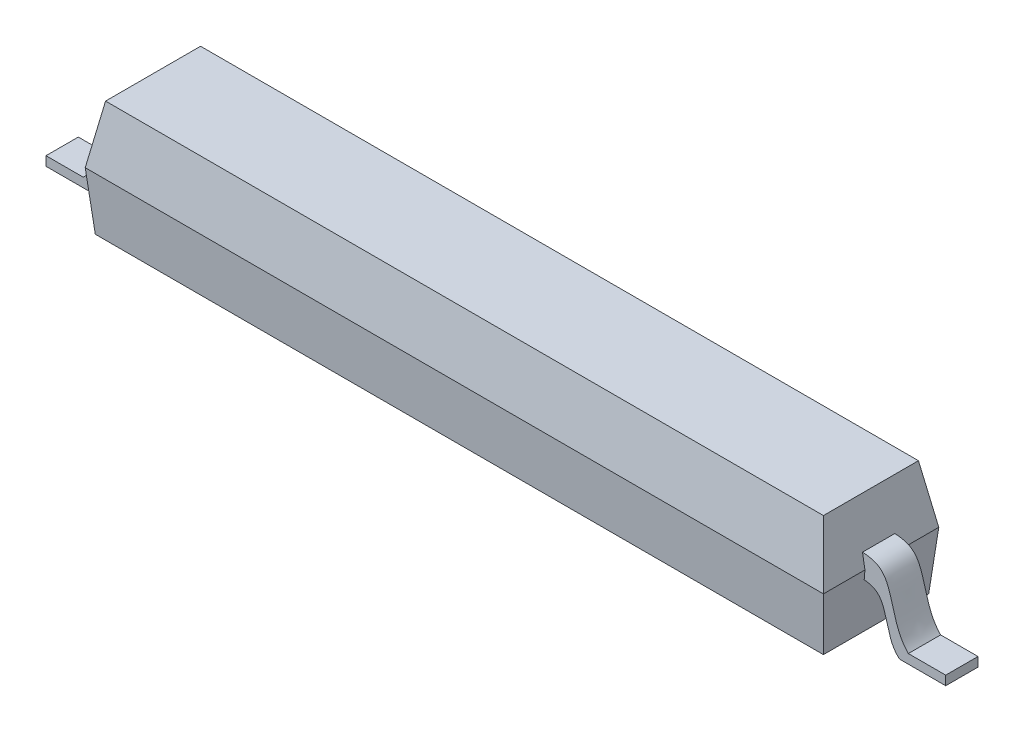
ISO-10303-21;
HEADER;
FILE_DESCRIPTION(('STEP AP214'),'2;1');
FILE_NAME('part.step','',(''),(''),'','','');
FILE_SCHEMA(('AUTOMOTIVE_DESIGN { 1 0 10303 214 1 1 1 1 }'));
ENDSEC;
DATA;
#1=APPLICATION_CONTEXT('core data for automotive mechanical design processes');
#2=APPLICATION_PROTOCOL_DEFINITION('international standard','automotive_design',2000,#1);
#3=PRODUCT_CONTEXT('',#1,'mechanical');
#4=PRODUCT('Part','Part','',(#3));
#5=PRODUCT_RELATED_PRODUCT_CATEGORY('part','',(#4));
#6=PRODUCT_DEFINITION_FORMATION('','',#4);
#7=PRODUCT_DEFINITION_CONTEXT('part definition',#1,'design');
#8=PRODUCT_DEFINITION('design','',#6,#7);
#9=PRODUCT_DEFINITION_SHAPE('','',#8);
#10=(LENGTH_UNIT() NAMED_UNIT(*) SI_UNIT(.MILLI.,.METRE.));
#11=(NAMED_UNIT(*) PLANE_ANGLE_UNIT() SI_UNIT($,.RADIAN.));
#12=(NAMED_UNIT(*) SI_UNIT($,.STERADIAN.) SOLID_ANGLE_UNIT());
#13=UNCERTAINTY_MEASURE_WITH_UNIT(LENGTH_MEASURE(1.E-05),#10,'distance_accuracy_value','');
#14=(GEOMETRIC_REPRESENTATION_CONTEXT(3) GLOBAL_UNCERTAINTY_ASSIGNED_CONTEXT((#13)) GLOBAL_UNIT_ASSIGNED_CONTEXT((#10,
#11,#12)) REPRESENTATION_CONTEXT('',''));
#15=CARTESIAN_POINT('',(0.,0.,0.));
#16=DIRECTION('',(0.,0.,1.));
#17=DIRECTION('',(1.,0.,0.));
#18=AXIS2_PLACEMENT_3D('',#15,#16,#17);
#19=CARTESIAN_POINT('',(8.,0.,-1.25));
#20=DIRECTION('',(0.996194698091746,-0.0871557427476584,0.));
#21=DIRECTION('',(0.0871557427476584,0.996194698091746,0.));
#22=AXIS2_PLACEMENT_3D('',#19,#20,#21);
#23=PLANE('',#22);
#24=DIRECTION('',(0.,0.,-1.));
#25=VECTOR('',#24,1.);
#26=CARTESIAN_POINT('',(7.98294649435726,-0.194922461441939,0.35));
#27=LINE('',#26,#25);
#28=CARTESIAN_POINT('',(7.98294648515938,-0.194922460917737,0.35));
#29=VERTEX_POINT('',#28);
#30=CARTESIAN_POINT('',(7.98294648515938,-0.194922460917737,-0.35));
#31=VERTEX_POINT('',#30);
#32=EDGE_CURVE('E11',#29,#31,#27,.T.);
#33=ORIENTED_EDGE('',*,*,#32,.F.);
#34=DIRECTION('',(0.0871557427476584,0.996194698091746,0.));
#35=VECTOR('',#34,1.);
#36=CARTESIAN_POINT('',(8.,0.,0.35));
#37=LINE('',#36,#35);
#38=CARTESIAN_POINT('',(8.,0.,0.35));
#39=VERTEX_POINT('',#38);
#40=EDGE_CURVE('E292',#29,#39,#37,.T.);
#41=ORIENTED_EDGE('',*,*,#40,.T.);
#42=DIRECTION('',(0.,0.,-1.));
#43=VECTOR('',#42,1.);
#44=CARTESIAN_POINT('',(8.,0.,-1.25));
#45=LINE('',#44,#43);
#46=CARTESIAN_POINT('',(8.,0.,1.25));
#47=VERTEX_POINT('',#46);
#48=EDGE_CURVE('E346',#47,#39,#45,.T.);
#49=ORIENTED_EDGE('',*,*,#48,.F.);
#50=DIRECTION('',(0.0868265938642478,0.992432509138967,0.0868265938642478));
#51=VECTOR('',#50,1.);
#52=CARTESIAN_POINT('',(7.87937828156693,-1.37871255053897,1.12937828156693));
#53=LINE('',#52,#51);
#54=CARTESIAN_POINT('',(7.89063917059259,-1.25,1.14063917059259));
#55=VERTEX_POINT('',#54);
#56=EDGE_CURVE('E360',#55,#47,#53,.T.);
#57=ORIENTED_EDGE('',*,*,#56,.F.);
#58=DIRECTION('',(0.,0.,-1.));
#59=VECTOR('',#58,1.);
#60=CARTESIAN_POINT('',(7.89063917059259,-1.25,0.));
#61=LINE('',#60,#59);
#62=CARTESIAN_POINT('',(7.89063917059259,-1.25,-1.14063917059259));
#63=VERTEX_POINT('',#62);
#64=EDGE_CURVE('E359',#55,#63,#61,.T.);
#65=ORIENTED_EDGE('',*,*,#64,.T.);
#66=DIRECTION('',(0.0868265938642478,0.992432509138967,-0.0868265938642478));
#67=VECTOR('',#66,1.);
#68=CARTESIAN_POINT('',(8.,0.,-1.25));
#69=LINE('',#68,#67);
#70=CARTESIAN_POINT('',(8.,0.,-1.25));
#71=VERTEX_POINT('',#70);
#72=EDGE_CURVE('E365',#63,#71,#69,.T.);
#73=ORIENTED_EDGE('',*,*,#72,.T.);
#74=CARTESIAN_POINT('',(8.,0.,-0.35));
#75=VERTEX_POINT('',#74);
#76=EDGE_CURVE('E328',#75,#71,#45,.T.);
#77=ORIENTED_EDGE('',*,*,#76,.F.);
#78=DIRECTION('',(0.0871557427476584,0.996194698091746,0.));
#79=VECTOR('',#78,1.);
#80=CARTESIAN_POINT('',(8.,0.,-0.35));
#81=LINE('',#80,#79);
#82=EDGE_CURVE('E49',#31,#75,#81,.T.);
#83=ORIENTED_EDGE('',*,*,#82,.F.);
#84=EDGE_LOOP('',(#33,#41,#49,#57,#65,#73,#77,#83));
#85=FACE_BOUND('',#84,.T.);
#86=ADVANCED_FACE('F34',(#85),#23,.T.);
#87=CARTESIAN_POINT('',(8.,0.,-1.25));
#88=DIRECTION('',(0.984807753012208,0.173648177666931,0.));
#89=DIRECTION('',(-0.173648177666931,0.984807753012208,0.));
#90=AXIS2_PLACEMENT_3D('',#87,#88,#89);
#91=PLANE('',#90);
#92=DIRECTION('',(-0.173648177666931,0.984807753012208,0.));
#93=VECTOR('',#92,1.);
#94=CARTESIAN_POINT('',(8.,0.,0.35));
#95=LINE('',#94,#93);
#96=CARTESIAN_POINT('',(7.94612343204482,0.305549155498041,0.35));
#97=VERTEX_POINT('',#96);
#98=EDGE_CURVE('E42',#97,#39,#95,.F.);
#99=ORIENTED_EDGE('',*,*,#98,.F.);
#100=DIRECTION('',(0.,0.,-1.));
#101=VECTOR('',#100,1.);
#102=CARTESIAN_POINT('',(7.94612344000728,0.305549155190273,0.35));
#103=LINE('',#102,#101);
#104=CARTESIAN_POINT('',(7.94612343204482,0.305549155498041,-0.35));
#105=VERTEX_POINT('',#104);
#106=EDGE_CURVE('E189',#105,#97,#103,.F.);
#107=ORIENTED_EDGE('',*,*,#106,.F.);
#108=DIRECTION('',(-0.173648177666931,0.984807753012208,0.));
#109=VECTOR('',#108,1.);
#110=CARTESIAN_POINT('',(8.,0.,-0.35));
#111=LINE('',#110,#109);
#112=EDGE_CURVE('E393',#105,#75,#111,.F.);
#113=ORIENTED_EDGE('',*,*,#112,.T.);
#114=ORIENTED_EDGE('',*,*,#76,.T.);
#115=DIRECTION('',(0.171087869746036,-0.970287525247814,-0.171087869746036));
#116=VECTOR('',#115,1.);
#117=CARTESIAN_POINT('',(7.53166305321221,2.65607081177282,-0.781663053212216));
#118=LINE('',#117,#116);
#119=CARTESIAN_POINT('',(7.77959127411442,1.25,-1.02959127411442));
#120=VERTEX_POINT('',#119);
#121=EDGE_CURVE('E325',#120,#71,#118,.T.);
#122=ORIENTED_EDGE('',*,*,#121,.F.);
#123=DIRECTION('',(0.,0.,1.));
#124=VECTOR('',#123,1.);
#125=CARTESIAN_POINT('',(7.77959127411442,1.25,-1.25));
#126=LINE('',#125,#124);
#127=CARTESIAN_POINT('',(7.77959127411442,1.25,1.02959127411442));
#128=VERTEX_POINT('',#127);
#129=EDGE_CURVE('E324',#128,#120,#126,.F.);
#130=ORIENTED_EDGE('',*,*,#129,.F.);
#131=DIRECTION('',(0.171087869746036,-0.970287525247814,0.171087869746036));
#132=VECTOR('',#131,1.);
#133=CARTESIAN_POINT('',(7.92682235206441,0.415011064339504,1.17682235206441));
#134=LINE('',#133,#132);
#135=EDGE_CURVE('E330',#128,#47,#134,.T.);
#136=ORIENTED_EDGE('',*,*,#135,.T.);
#137=ORIENTED_EDGE('',*,*,#48,.T.);
#138=EDGE_LOOP('',(#99,#107,#113,#114,#122,#130,#136,#137));
#139=FACE_BOUND('',#138,.T.);
#140=ADVANCED_FACE('F400',(#139),#91,.T.);
#141=CARTESIAN_POINT('',(-8.,0.,-1.25));
#142=DIRECTION('',(-0.996194698091746,-0.0871557427476584,0.));
#143=DIRECTION('',(0.0871557427476584,-0.996194698091746,0.));
#144=AXIS2_PLACEMENT_3D('',#141,#142,#143);
#145=PLANE('',#144);
#146=DIRECTION('',(0.,0.,1.));
#147=VECTOR('',#146,1.);
#148=CARTESIAN_POINT('',(-8.,0.,-1.25));
#149=LINE('',#148,#147);
#150=CARTESIAN_POINT('',(-8.,0.,0.35));
#151=VERTEX_POINT('',#150);
#152=CARTESIAN_POINT('',(-8.,0.,1.25));
#153=VERTEX_POINT('',#152);
#154=EDGE_CURVE('E352',#151,#153,#149,.T.);
#155=ORIENTED_EDGE('',*,*,#154,.F.);
#156=DIRECTION('',(0.0871557427476584,-0.996194698091746,0.));
#157=VECTOR('',#156,1.);
#158=CARTESIAN_POINT('',(-8.,0.,0.35));
#159=LINE('',#158,#157);
#160=CARTESIAN_POINT('',(-7.98294648515938,-0.194922460917737,0.35));
#161=VERTEX_POINT('',#160);
#162=EDGE_CURVE('E321',#151,#161,#159,.T.);
#163=ORIENTED_EDGE('',*,*,#162,.T.);
#164=DIRECTION('',(0.,0.,-1.));
#165=VECTOR('',#164,1.);
#166=CARTESIAN_POINT('',(-7.98294649435726,-0.194922461441939,0.35));
#167=LINE('',#166,#165);
#168=CARTESIAN_POINT('',(-7.98294648515938,-0.194922460917737,-0.35));
#169=VERTEX_POINT('',#168);
#170=EDGE_CURVE('E390',#161,#169,#167,.T.);
#171=ORIENTED_EDGE('',*,*,#170,.T.);
#172=DIRECTION('',(0.0871557427476584,-0.996194698091746,0.));
#173=VECTOR('',#172,1.);
#174=CARTESIAN_POINT('',(-8.,0.,-0.35));
#175=LINE('',#174,#173);
#176=CARTESIAN_POINT('',(-8.,0.,-0.35));
#177=VERTEX_POINT('',#176);
#178=EDGE_CURVE('E311',#177,#169,#175,.T.);
#179=ORIENTED_EDGE('',*,*,#178,.F.);
#180=CARTESIAN_POINT('',(-8.,0.,-1.25));
#181=VERTEX_POINT('',#180);
#182=EDGE_CURVE('E353',#181,#177,#149,.T.);
#183=ORIENTED_EDGE('',*,*,#182,.F.);
#184=DIRECTION('',(-0.0868265938642478,0.992432509138967,-0.0868265938642478));
#185=VECTOR('',#184,1.);
#186=CARTESIAN_POINT('',(-8.,0.,-1.25));
#187=LINE('',#186,#185);
#188=CARTESIAN_POINT('',(-7.89063917059259,-1.25,-1.14063917059259));
#189=VERTEX_POINT('',#188);
#190=EDGE_CURVE('E368',#189,#181,#187,.T.);
#191=ORIENTED_EDGE('',*,*,#190,.F.);
#192=DIRECTION('',(0.,0.,1.));
#193=VECTOR('',#192,1.);
#194=CARTESIAN_POINT('',(-7.89063917059259,-1.25,0.));
#195=LINE('',#194,#193);
#196=CARTESIAN_POINT('',(-7.89063917059259,-1.25,1.14063917059259));
#197=VERTEX_POINT('',#196);
#198=EDGE_CURVE('E378',#189,#197,#195,.T.);
#199=ORIENTED_EDGE('',*,*,#198,.T.);
#200=DIRECTION('',(-0.0868265938642478,0.992432509138967,0.0868265938642478));
#201=VECTOR('',#200,1.);
#202=CARTESIAN_POINT('',(-7.98115285649483,-0.215423836021714,1.23115285649483));
#203=LINE('',#202,#201);
#204=EDGE_CURVE('E364',#197,#153,#203,.T.);
#205=ORIENTED_EDGE('',*,*,#204,.T.);
#206=EDGE_LOOP('',(#155,#163,#171,#179,#183,#191,#199,#205));
#207=FACE_BOUND('',#206,.T.);
#208=ADVANCED_FACE('F451',(#207),#145,.T.);
#209=CARTESIAN_POINT('',(-8.,0.,-1.25));
#210=DIRECTION('',(-0.984807753012208,0.173648177666931,0.));
#211=DIRECTION('',(-0.173648177666931,-0.984807753012208,0.));
#212=AXIS2_PLACEMENT_3D('',#209,#210,#211);
#213=PLANE('',#212);
#214=DIRECTION('',(-0.173648177666931,-0.984807753012208,0.));
#215=VECTOR('',#214,1.);
#216=CARTESIAN_POINT('',(-8.,0.,0.35));
#217=LINE('',#216,#215);
#218=CARTESIAN_POINT('',(-7.94612343204482,0.305549155498041,0.35));
#219=VERTEX_POINT('',#218);
#220=EDGE_CURVE('E388',#151,#219,#217,.F.);
#221=ORIENTED_EDGE('',*,*,#220,.F.);
#222=ORIENTED_EDGE('',*,*,#154,.T.);
#223=DIRECTION('',(-0.171087869746036,-0.970287525247814,0.171087869746036));
#224=VECTOR('',#223,1.);
#225=CARTESIAN_POINT('',(-8.,0.,1.25));
#226=LINE('',#225,#224);
#227=CARTESIAN_POINT('',(-7.77959127411442,1.25,1.02959127411442));
#228=VERTEX_POINT('',#227);
#229=EDGE_CURVE('E333',#228,#153,#226,.T.);
#230=ORIENTED_EDGE('',*,*,#229,.F.);
#231=DIRECTION('',(0.,0.,-1.));
#232=VECTOR('',#231,1.);
#233=CARTESIAN_POINT('',(-7.77959127411442,1.25,-1.25));
#234=LINE('',#233,#232);
#235=CARTESIAN_POINT('',(-7.77959127411442,1.25,-1.02959127411442));
#236=VERTEX_POINT('',#235);
#237=EDGE_CURVE('E343',#236,#228,#234,.F.);
#238=ORIENTED_EDGE('',*,*,#237,.F.);
#239=DIRECTION('',(-0.171087869746036,-0.970287525247814,-0.171087869746036));
#240=VECTOR('',#239,1.);
#241=CARTESIAN_POINT('',(-8.,0.,-1.25));
#242=LINE('',#241,#240);
#243=EDGE_CURVE('E329',#236,#181,#242,.T.);
#244=ORIENTED_EDGE('',*,*,#243,.T.);
#245=ORIENTED_EDGE('',*,*,#182,.T.);
#246=DIRECTION('',(-0.173648177666931,-0.984807753012208,0.));
#247=VECTOR('',#246,1.);
#248=CARTESIAN_POINT('',(-8.,0.,-0.35));
#249=LINE('',#248,#247);
#250=CARTESIAN_POINT('',(-7.94612343971455,0.305549156850421,-0.35));
#251=VERTEX_POINT('',#250);
#252=EDGE_CURVE('E363',#177,#251,#249,.F.);
#253=ORIENTED_EDGE('',*,*,#252,.T.);
#254=DIRECTION('',(0.,0.,-1.));
#255=VECTOR('',#254,1.);
#256=CARTESIAN_POINT('',(-7.94612344000728,0.305549155190273,0.35));
#257=LINE('',#256,#255);
#258=EDGE_CURVE('E385',#251,#219,#257,.F.);
#259=ORIENTED_EDGE('',*,*,#258,.T.);
#260=EDGE_LOOP('',(#221,#222,#230,#238,#244,#245,#253,#259));
#261=FACE_BOUND('',#260,.T.);
#262=ADVANCED_FACE('F458',(#261),#213,.T.);
#263=CARTESIAN_POINT('',(-8.,0.,1.25));
#264=DIRECTION('',(0.,-0.0871557427476584,0.996194698091746));
#265=DIRECTION('',(0.,-0.996194698091746,-0.0871557427476584));
#266=AXIS2_PLACEMENT_3D('',#263,#264,#265);
#267=PLANE('',#266);
#268=DIRECTION('',(1.,0.,0.));
#269=VECTOR('',#268,1.);
#270=CARTESIAN_POINT('',(-8.,0.,1.25));
#271=LINE('',#270,#269);
#272=EDGE_CURVE('E356',#153,#47,#271,.T.);
#273=ORIENTED_EDGE('',*,*,#272,.F.);
#274=ORIENTED_EDGE('',*,*,#204,.F.);
#275=DIRECTION('',(1.,0.,0.));
#276=VECTOR('',#275,1.);
#277=CARTESIAN_POINT('',(0.,-1.25,1.1406391705926));
#278=LINE('',#277,#276);
#279=EDGE_CURVE('E369',#197,#55,#278,.T.);
#280=ORIENTED_EDGE('',*,*,#279,.T.);
#281=ORIENTED_EDGE('',*,*,#56,.T.);
#282=EDGE_LOOP('',(#273,#274,#280,#281));
#283=FACE_BOUND('',#282,.T.);
#284=ADVANCED_FACE('F36',(#283),#267,.T.);
#285=CARTESIAN_POINT('',(-8.,0.,-1.25));
#286=DIRECTION('',(0.,-0.0871557427476584,-0.996194698091746));
#287=DIRECTION('',(0.,0.996194698091746,-0.0871557427476584));
#288=AXIS2_PLACEMENT_3D('',#285,#286,#287);
#289=PLANE('',#288);
#290=DIRECTION('',(-1.,0.,0.));
#291=VECTOR('',#290,1.);
#292=CARTESIAN_POINT('',(-8.,0.,-1.25));
#293=LINE('',#292,#291);
#294=EDGE_CURVE('E349',#71,#181,#293,.T.);
#295=ORIENTED_EDGE('',*,*,#294,.F.);
#296=ORIENTED_EDGE('',*,*,#72,.F.);
#297=DIRECTION('',(-1.,0.,0.));
#298=VECTOR('',#297,1.);
#299=CARTESIAN_POINT('',(0.,-1.25,-1.1406391705926));
#300=LINE('',#299,#298);
#301=EDGE_CURVE('E375',#63,#189,#300,.T.);
#302=ORIENTED_EDGE('',*,*,#301,.T.);
#303=ORIENTED_EDGE('',*,*,#190,.T.);
#304=EDGE_LOOP('',(#295,#296,#302,#303));
#305=FACE_BOUND('',#304,.T.);
#306=ADVANCED_FACE('F418',(#305),#289,.T.);
#307=CARTESIAN_POINT('',(0.,-1.25,0.));
#308=DIRECTION('',(0.,1.,0.));
#309=DIRECTION('',(0.,0.,1.));
#310=AXIS2_PLACEMENT_3D('',#307,#308,#309);
#311=PLANE('',#310);
#312=ORIENTED_EDGE('',*,*,#64,.F.);
#313=ORIENTED_EDGE('',*,*,#279,.F.);
#314=ORIENTED_EDGE('',*,*,#198,.F.);
#315=ORIENTED_EDGE('',*,*,#301,.F.);
#316=EDGE_LOOP('',(#312,#313,#314,#315));
#317=FACE_BOUND('',#316,.T.);
#318=ADVANCED_FACE('F414',(#317),#311,.F.);
#319=CARTESIAN_POINT('',(-8.,0.,-1.25));
#320=DIRECTION('',(0.,0.173648177666931,-0.984807753012208));
#321=DIRECTION('',(0.,0.984807753012208,0.173648177666931));
#322=AXIS2_PLACEMENT_3D('',#319,#320,#321);
#323=PLANE('',#322);
#324=ORIENTED_EDGE('',*,*,#294,.T.);
#325=ORIENTED_EDGE('',*,*,#243,.F.);
#326=DIRECTION('',(1.,0.,0.));
#327=VECTOR('',#326,1.);
#328=CARTESIAN_POINT('',(-8.,1.25,-1.02959127411442));
#329=LINE('',#328,#327);
#330=EDGE_CURVE('E341',#120,#236,#329,.F.);
#331=ORIENTED_EDGE('',*,*,#330,.F.);
#332=ORIENTED_EDGE('',*,*,#121,.T.);
#333=EDGE_LOOP('',(#324,#325,#331,#332));
#334=FACE_BOUND('',#333,.T.);
#335=ADVANCED_FACE('F484',(#334),#323,.T.);
#336=CARTESIAN_POINT('',(-8.,0.,1.25));
#337=DIRECTION('',(0.,0.173648177666931,0.984807753012208));
#338=DIRECTION('',(0.,-0.984807753012208,0.173648177666931));
#339=AXIS2_PLACEMENT_3D('',#336,#337,#338);
#340=PLANE('',#339);
#341=ORIENTED_EDGE('',*,*,#272,.T.);
#342=ORIENTED_EDGE('',*,*,#135,.F.);
#343=DIRECTION('',(-1.,0.,0.));
#344=VECTOR('',#343,1.);
#345=CARTESIAN_POINT('',(-8.,1.25,1.02959127411442));
#346=LINE('',#345,#344);
#347=EDGE_CURVE('E334',#228,#128,#346,.F.);
#348=ORIENTED_EDGE('',*,*,#347,.F.);
#349=ORIENTED_EDGE('',*,*,#229,.T.);
#350=EDGE_LOOP('',(#341,#342,#348,#349));
#351=FACE_BOUND('',#350,.T.);
#352=ADVANCED_FACE('F406',(#351),#340,.T.);
#353=CARTESIAN_POINT('',(0.,1.25,0.));
#354=DIRECTION('',(0.,1.,0.));
#355=DIRECTION('',(0.,0.,1.));
#356=AXIS2_PLACEMENT_3D('',#353,#354,#355);
#357=PLANE('',#356);
#358=ORIENTED_EDGE('',*,*,#129,.T.);
#359=ORIENTED_EDGE('',*,*,#330,.T.);
#360=ORIENTED_EDGE('',*,*,#237,.T.);
#361=ORIENTED_EDGE('',*,*,#347,.T.);
#362=EDGE_LOOP('',(#358,#359,#360,#361));
#363=FACE_BOUND('',#362,.T.);
#364=ADVANCED_FACE('F486',(#363),#357,.T.);
#365=CARTESIAN_POINT('',(-8.94,-1.1,0.35));
#366=CARTESIAN_POINT('',(-8.7827092020961,-0.944169039550464,0.35));
#367=CARTESIAN_POINT('',(-8.60142761110482,-0.45185329780849,0.35));
#368=CARTESIAN_POINT('',(-8.50476244147385,0.0742099294544724,0.35));
#369=CARTESIAN_POINT('',(-8.23046324208843,0.306606593023502,0.35));
#370=CARTESIAN_POINT('',(-7.88979563705721,0.306606593023501,0.35));
#371=B_SPLINE_CURVE_WITH_KNOTS('',3,(#365,#366,#367,#368,#369,#370),.UNSPECIFIED.,.F.,.F.,(4,1,
1,4),(0.,0.318526041978057,0.678515107085578,1.),.UNSPECIFIED.);
#372=DIRECTION('',(0.,0.,-1.));
#373=VECTOR('',#372,1.);
#374=SURFACE_OF_LINEAR_EXTRUSION('',#371,#373);
#375=ORIENTED_EDGE('',*,*,#258,.F.);
#376=CARTESIAN_POINT('',(-8.94,-1.1,-0.35));
#377=CARTESIAN_POINT('',(-8.7827092020961,-0.944169039550464,-0.35));
#378=CARTESIAN_POINT('',(-8.60142761110482,-0.45185329780849,-0.35));
#379=CARTESIAN_POINT('',(-8.50476244147385,0.0742099294544724,-0.35));
#380=CARTESIAN_POINT('',(-8.23046324208843,0.306606593023502,-0.35));
#381=CARTESIAN_POINT('',(-7.88979563705721,0.306606593023501,-0.35));
#382=B_SPLINE_CURVE_WITH_KNOTS('',3,(#376,#377,#378,#379,#380,#381),.UNSPECIFIED.,.F.,.F.,(4,1,
1,4),(0.,0.318526041978057,0.678515107085578,1.),.UNSPECIFIED.);
#383=CARTESIAN_POINT('',(-8.94,-1.1,-0.35));
#384=VERTEX_POINT('',#383);
#385=EDGE_CURVE('E57',#384,#251,#382,.T.);
#386=ORIENTED_EDGE('',*,*,#385,.F.);
#387=DIRECTION('',(0.,0.,-1.));
#388=VECTOR('',#387,1.);
#389=CARTESIAN_POINT('',(-8.94,-1.1,0.35));
#390=LINE('',#389,#388);
#391=CARTESIAN_POINT('',(-8.94,-1.1,0.35));
#392=VERTEX_POINT('',#391);
#393=EDGE_CURVE('E309',#392,#384,#390,.T.);
#394=ORIENTED_EDGE('',*,*,#393,.F.);
#395=EDGE_CURVE('E274',#392,#219,#371,.T.);
#396=ORIENTED_EDGE('',*,*,#395,.T.);
#397=EDGE_LOOP('',(#375,#386,#394,#396));
#398=FACE_BOUND('',#397,.T.);
#399=ADVANCED_FACE('F252',(#398),#374,.T.);
#400=CARTESIAN_POINT('',(-8.94,-1.1,0.35));
#401=DIRECTION('',(0.,-1.,0.));
#402=DIRECTION('',(1.,0.,0.));
#403=AXIS2_PLACEMENT_3D('',#400,#401,#402);
#404=PLANE('',#403);
#405=DIRECTION('',(-1.,0.,0.));
#406=VECTOR('',#405,1.);
#407=CARTESIAN_POINT('',(-8.94,-1.1,-0.35));
#408=LINE('',#407,#406);
#409=CARTESIAN_POINT('',(-9.75,-1.1,-0.35));
#410=VERTEX_POINT('',#409);
#411=EDGE_CURVE('E307',#384,#410,#408,.T.);
#412=ORIENTED_EDGE('',*,*,#411,.T.);
#413=DIRECTION('',(0.,0.,-1.));
#414=VECTOR('',#413,1.);
#415=CARTESIAN_POINT('',(-9.75,-1.1,0.35));
#416=LINE('',#415,#414);
#417=CARTESIAN_POINT('',(-9.75,-1.1,0.35));
#418=VERTEX_POINT('',#417);
#419=EDGE_CURVE('E312',#418,#410,#416,.T.);
#420=ORIENTED_EDGE('',*,*,#419,.F.);
#421=DIRECTION('',(-1.,0.,0.));
#422=VECTOR('',#421,1.);
#423=CARTESIAN_POINT('',(-8.94,-1.1,0.35));
#424=LINE('',#423,#422);
#425=EDGE_CURVE('E285',#392,#418,#424,.T.);
#426=ORIENTED_EDGE('',*,*,#425,.F.);
#427=ORIENTED_EDGE('',*,*,#393,.T.);
#428=EDGE_LOOP('',(#412,#420,#426,#427));
#429=FACE_BOUND('',#428,.T.);
#430=ADVANCED_FACE('F248',(#429),#404,.F.);
#431=CARTESIAN_POINT('',(-9.75,-1.1,0.35));
#432=DIRECTION('',(1.,0.,0.));
#433=DIRECTION('',(0.,0.,-1.));
#434=AXIS2_PLACEMENT_3D('',#431,#432,#433);
#435=PLANE('',#434);
#436=DIRECTION('',(0.,-1.,0.));
#437=VECTOR('',#436,1.);
#438=CARTESIAN_POINT('',(-9.75,-1.1,-0.35));
#439=LINE('',#438,#437);
#440=CARTESIAN_POINT('',(-9.75,-1.3,-0.35));
#441=VERTEX_POINT('',#440);
#442=EDGE_CURVE('E305',#410,#441,#439,.T.);
#443=ORIENTED_EDGE('',*,*,#442,.T.);
#444=DIRECTION('',(0.,0.,-1.));
#445=VECTOR('',#444,1.);
#446=CARTESIAN_POINT('',(-9.75,-1.3,0.35));
#447=LINE('',#446,#445);
#448=CARTESIAN_POINT('',(-9.75,-1.3,0.35));
#449=VERTEX_POINT('',#448);
#450=EDGE_CURVE('E315',#449,#441,#447,.T.);
#451=ORIENTED_EDGE('',*,*,#450,.F.);
#452=DIRECTION('',(0.,-1.,0.));
#453=VECTOR('',#452,1.);
#454=CARTESIAN_POINT('',(-9.75,-1.1,0.35));
#455=LINE('',#454,#453);
#456=EDGE_CURVE('E283',#418,#449,#455,.T.);
#457=ORIENTED_EDGE('',*,*,#456,.F.);
#458=ORIENTED_EDGE('',*,*,#419,.T.);
#459=EDGE_LOOP('',(#443,#451,#457,#458));
#460=FACE_BOUND('',#459,.T.);
#461=ADVANCED_FACE('F251',(#460),#435,.F.);
#462=CARTESIAN_POINT('',(-9.75,-1.3,0.35));
#463=DIRECTION('',(0.,1.,0.));
#464=DIRECTION('',(0.,0.,1.));
#465=AXIS2_PLACEMENT_3D('',#462,#463,#464);
#466=PLANE('',#465);
#467=DIRECTION('',(1.,0.,0.));
#468=VECTOR('',#467,1.);
#469=CARTESIAN_POINT('',(-9.75,-1.3,-0.35));
#470=LINE('',#469,#468);
#471=CARTESIAN_POINT('',(-8.75,-1.3,-0.35));
#472=VERTEX_POINT('',#471);
#473=EDGE_CURVE('E300',#441,#472,#470,.T.);
#474=ORIENTED_EDGE('',*,*,#473,.T.);
#475=DIRECTION('',(0.,0.,-1.));
#476=VECTOR('',#475,1.);
#477=CARTESIAN_POINT('',(-8.75,-1.3,0.35));
#478=LINE('',#477,#476);
#479=CARTESIAN_POINT('',(-8.75,-1.3,0.35));
#480=VERTEX_POINT('',#479);
#481=EDGE_CURVE('E287',#480,#472,#478,.T.);
#482=ORIENTED_EDGE('',*,*,#481,.F.);
#483=DIRECTION('',(1.,0.,0.));
#484=VECTOR('',#483,1.);
#485=CARTESIAN_POINT('',(-9.75,-1.3,0.35));
#486=LINE('',#485,#484);
#487=EDGE_CURVE('E273',#449,#480,#486,.T.);
#488=ORIENTED_EDGE('',*,*,#487,.F.);
#489=ORIENTED_EDGE('',*,*,#450,.T.);
#490=EDGE_LOOP('',(#474,#482,#488,#489));
#491=FACE_BOUND('',#490,.T.);
#492=ADVANCED_FACE('F256',(#491),#466,.F.);
#493=CARTESIAN_POINT('',(-8.75,-1.3,0.35));
#494=CARTESIAN_POINT('',(-8.5988271612267,-1.16864734192871,0.35));
#495=CARTESIAN_POINT('',(-8.52023434335326,-0.919812082194598,0.35));
#496=CARTESIAN_POINT('',(-8.36705414464146,-0.306395682769512,0.35));
#497=CARTESIAN_POINT('',(-8.13980889724813,-0.193393406976499,0.35));
#498=CARTESIAN_POINT('',(-7.92698735043982,-0.193393406976499,0.35));
#499=B_SPLINE_CURVE_WITH_KNOTS('',3,(#493,#494,#495,#496,#497,#498),.UNSPECIFIED.,.F.,.F.,(4,1,
1,4),(0.,0.417832957229827,0.685176508113132,1.),.UNSPECIFIED.);
#500=DIRECTION('',(0.,0.,-1.));
#501=VECTOR('',#500,1.);
#502=SURFACE_OF_LINEAR_EXTRUSION('',#499,#501);
#503=ORIENTED_EDGE('',*,*,#170,.F.);
#504=EDGE_CURVE('E267',#480,#161,#499,.T.);
#505=ORIENTED_EDGE('',*,*,#504,.F.);
#506=ORIENTED_EDGE('',*,*,#481,.T.);
#507=CARTESIAN_POINT('',(-8.75,-1.3,-0.35));
#508=CARTESIAN_POINT('',(-8.5988271612267,-1.16864734192871,-0.35));
#509=CARTESIAN_POINT('',(-8.52023434335326,-0.919812082194598,-0.35));
#510=CARTESIAN_POINT('',(-8.36705414464146,-0.306395682769512,-0.35));
#511=CARTESIAN_POINT('',(-8.13980889724813,-0.193393406976499,-0.35));
#512=CARTESIAN_POINT('',(-7.92698735043982,-0.193393406976499,-0.35));
#513=B_SPLINE_CURVE_WITH_KNOTS('',3,(#507,#508,#509,#510,#511,#512),.UNSPECIFIED.,.F.,.F.,(4,1,
1,4),(0.,0.417832957229827,0.685176508113132,1.),.UNSPECIFIED.);
#514=EDGE_CURVE('E291',#472,#169,#513,.T.);
#515=ORIENTED_EDGE('',*,*,#514,.T.);
#516=EDGE_LOOP('',(#503,#505,#506,#515));
#517=FACE_BOUND('',#516,.T.);
#518=ADVANCED_FACE('F244',(#517),#502,.F.);
#519=CARTESIAN_POINT('',(-8.5493294063602,-0.196419834170352,0.35));
#520=DIRECTION('',(0.,0.,-1.));
#521=DIRECTION('',(-1.,0.,0.));
#522=AXIS2_PLACEMENT_3D('',#519,#520,#521);
#523=PLANE('',#522);
#524=ORIENTED_EDGE('',*,*,#162,.F.);
#525=ORIENTED_EDGE('',*,*,#220,.T.);
#526=ORIENTED_EDGE('',*,*,#395,.F.);
#527=ORIENTED_EDGE('',*,*,#425,.T.);
#528=ORIENTED_EDGE('',*,*,#456,.T.);
#529=ORIENTED_EDGE('',*,*,#487,.T.);
#530=ORIENTED_EDGE('',*,*,#504,.T.);
#531=EDGE_LOOP('',(#524,#525,#526,#527,#528,#529,#530));
#532=FACE_BOUND('',#531,.T.);
#533=ADVANCED_FACE('F241',(#532),#523,.F.);
#534=CARTESIAN_POINT('',(-8.5493294063602,-0.196419834170352,-0.35));
#535=DIRECTION('',(0.,0.,-1.));
#536=DIRECTION('',(-1.,0.,0.));
#537=AXIS2_PLACEMENT_3D('',#534,#535,#536);
#538=PLANE('',#537);
#539=ORIENTED_EDGE('',*,*,#252,.F.);
#540=ORIENTED_EDGE('',*,*,#178,.T.);
#541=ORIENTED_EDGE('',*,*,#514,.F.);
#542=ORIENTED_EDGE('',*,*,#473,.F.);
#543=ORIENTED_EDGE('',*,*,#442,.F.);
#544=ORIENTED_EDGE('',*,*,#411,.F.);
#545=ORIENTED_EDGE('',*,*,#385,.T.);
#546=EDGE_LOOP('',(#539,#540,#541,#542,#543,#544,#545));
#547=FACE_BOUND('',#546,.T.);
#548=ADVANCED_FACE('F240',(#547),#538,.T.);
#549=CARTESIAN_POINT('',(8.94,-1.1,0.35));
#550=CARTESIAN_POINT('',(8.7827092020961,-0.944169039550464,0.35));
#551=CARTESIAN_POINT('',(8.60142761110482,-0.45185329780849,0.35));
#552=CARTESIAN_POINT('',(8.50476244147385,0.0742099294544724,0.35));
#553=CARTESIAN_POINT('',(8.23046324208843,0.306606593023502,0.35));
#554=CARTESIAN_POINT('',(7.88979563705721,0.306606593023501,0.35));
#555=B_SPLINE_CURVE_WITH_KNOTS('',3,(#549,#550,#551,#552,#553,#554),.UNSPECIFIED.,.F.,.F.,(4,1,
1,4),(0.,0.318526041978057,0.678515107085578,1.),.UNSPECIFIED.);
#556=DIRECTION('',(0.,0.,-1.));
#557=VECTOR('',#556,1.);
#558=SURFACE_OF_LINEAR_EXTRUSION('',#555,#557);
#559=CARTESIAN_POINT('',(8.94,-1.1,-0.35));
#560=CARTESIAN_POINT('',(8.7827092020961,-0.944169039550464,-0.35));
#561=CARTESIAN_POINT('',(8.60142761110482,-0.45185329780849,-0.35));
#562=CARTESIAN_POINT('',(8.50476244147385,0.0742099294544724,-0.35));
#563=CARTESIAN_POINT('',(8.23046324208843,0.306606593023502,-0.35));
#564=CARTESIAN_POINT('',(7.88979563705721,0.306606593023501,-0.35));
#565=B_SPLINE_CURVE_WITH_KNOTS('',3,(#559,#560,#561,#562,#563,#564),.UNSPECIFIED.,.F.,.F.,(4,1,
1,4),(0.,0.318526041978057,0.678515107085578,1.),.UNSPECIFIED.);
#566=CARTESIAN_POINT('',(8.94,-1.1,-0.35));
#567=VERTEX_POINT('',#566);
#568=EDGE_CURVE('E213',#567,#105,#565,.T.);
#569=ORIENTED_EDGE('',*,*,#568,.T.);
#570=ORIENTED_EDGE('',*,*,#106,.T.);
#571=CARTESIAN_POINT('',(8.94,-1.1,0.35));
#572=VERTEX_POINT('',#571);
#573=EDGE_CURVE('E186',#572,#97,#555,.T.);
#574=ORIENTED_EDGE('',*,*,#573,.F.);
#575=DIRECTION('',(0.,0.,-1.));
#576=VECTOR('',#575,1.);
#577=CARTESIAN_POINT('',(8.94,-1.1,0.35));
#578=LINE('',#577,#576);
#579=EDGE_CURVE('E172',#572,#567,#578,.T.);
#580=ORIENTED_EDGE('',*,*,#579,.T.);
#581=EDGE_LOOP('',(#569,#570,#574,#580));
#582=FACE_BOUND('',#581,.T.);
#583=ADVANCED_FACE('F187',(#582),#558,.F.);
#584=CARTESIAN_POINT('',(8.75,-1.3,0.35));
#585=CARTESIAN_POINT('',(8.5988271612267,-1.16864734192871,0.35));
#586=CARTESIAN_POINT('',(8.52023434335326,-0.919812082194598,0.35));
#587=CARTESIAN_POINT('',(8.36705414464146,-0.306395682769512,0.35));
#588=CARTESIAN_POINT('',(8.13980889724813,-0.193393406976499,0.35));
#589=CARTESIAN_POINT('',(7.92698735043982,-0.193393406976499,0.35));
#590=B_SPLINE_CURVE_WITH_KNOTS('',3,(#584,#585,#586,#587,#588,#589),.UNSPECIFIED.,.F.,.F.,(4,1,
1,4),(0.,0.417832957229827,0.685176508113132,1.),.UNSPECIFIED.);
#591=DIRECTION('',(0.,0.,-1.));
#592=VECTOR('',#591,1.);
#593=SURFACE_OF_LINEAR_EXTRUSION('',#590,#592);
#594=CARTESIAN_POINT('',(8.75,-1.3,0.35));
#595=VERTEX_POINT('',#594);
#596=EDGE_CURVE('E183',#595,#29,#590,.T.);
#597=ORIENTED_EDGE('',*,*,#596,.T.);
#598=ORIENTED_EDGE('',*,*,#32,.T.);
#599=CARTESIAN_POINT('',(8.75,-1.3,-0.35));
#600=CARTESIAN_POINT('',(8.5988271612267,-1.16864734192871,-0.35));
#601=CARTESIAN_POINT('',(8.52023434335326,-0.919812082194598,-0.35));
#602=CARTESIAN_POINT('',(8.36705414464146,-0.306395682769512,-0.35));
#603=CARTESIAN_POINT('',(8.13980889724813,-0.193393406976499,-0.35));
#604=CARTESIAN_POINT('',(7.92698735043982,-0.193393406976499,-0.35));
#605=B_SPLINE_CURVE_WITH_KNOTS('',3,(#599,#600,#601,#602,#603,#604),.UNSPECIFIED.,.F.,.F.,(4,1,
1,4),(0.,0.417832957229827,0.685176508113132,1.),.UNSPECIFIED.);
#606=CARTESIAN_POINT('',(8.75,-1.3,-0.35));
#607=VERTEX_POINT('',#606);
#608=EDGE_CURVE('E192',#607,#31,#605,.T.);
#609=ORIENTED_EDGE('',*,*,#608,.F.);
#610=DIRECTION('',(0.,0.,-1.));
#611=VECTOR('',#610,1.);
#612=CARTESIAN_POINT('',(8.75,-1.3,0.35));
#613=LINE('',#612,#611);
#614=EDGE_CURVE('E431',#595,#607,#613,.T.);
#615=ORIENTED_EDGE('',*,*,#614,.F.);
#616=EDGE_LOOP('',(#597,#598,#609,#615));
#617=FACE_BOUND('',#616,.T.);
#618=ADVANCED_FACE('F221',(#617),#593,.T.);
#619=CARTESIAN_POINT('',(9.75,-1.3,0.35));
#620=DIRECTION('',(0.,-1.,0.));
#621=DIRECTION('',(0.,0.,-1.));
#622=AXIS2_PLACEMENT_3D('',#619,#620,#621);
#623=PLANE('',#622);
#624=DIRECTION('',(-1.,0.,0.));
#625=VECTOR('',#624,1.);
#626=CARTESIAN_POINT('',(9.75,-1.3,-0.35));
#627=LINE('',#626,#625);
#628=CARTESIAN_POINT('',(9.75,-1.3,-0.35));
#629=VERTEX_POINT('',#628);
#630=EDGE_CURVE('E423',#629,#607,#627,.T.);
#631=ORIENTED_EDGE('',*,*,#630,.F.);
#632=DIRECTION('',(0.,0.,-1.));
#633=VECTOR('',#632,1.);
#634=CARTESIAN_POINT('',(9.75,-1.3,0.35));
#635=LINE('',#634,#633);
#636=CARTESIAN_POINT('',(9.75,-1.3,0.35));
#637=VERTEX_POINT('',#636);
#638=EDGE_CURVE('E436',#637,#629,#635,.T.);
#639=ORIENTED_EDGE('',*,*,#638,.F.);
#640=DIRECTION('',(-1.,0.,0.));
#641=VECTOR('',#640,1.);
#642=CARTESIAN_POINT('',(9.75,-1.3,0.35));
#643=LINE('',#642,#641);
#644=EDGE_CURVE('E200',#637,#595,#643,.T.);
#645=ORIENTED_EDGE('',*,*,#644,.T.);
#646=ORIENTED_EDGE('',*,*,#614,.T.);
#647=EDGE_LOOP('',(#631,#639,#645,#646));
#648=FACE_BOUND('',#647,.T.);
#649=ADVANCED_FACE('F225',(#648),#623,.T.);
#650=CARTESIAN_POINT('',(9.75,-1.1,0.35));
#651=DIRECTION('',(1.,0.,0.));
#652=DIRECTION('',(0.,0.,-1.));
#653=AXIS2_PLACEMENT_3D('',#650,#651,#652);
#654=PLANE('',#653);
#655=DIRECTION('',(0.,-1.,0.));
#656=VECTOR('',#655,1.);
#657=CARTESIAN_POINT('',(9.75,-1.1,-0.35));
#658=LINE('',#657,#656);
#659=CARTESIAN_POINT('',(9.75,-1.1,-0.35));
#660=VERTEX_POINT('',#659);
#661=EDGE_CURVE('E421',#660,#629,#658,.T.);
#662=ORIENTED_EDGE('',*,*,#661,.F.);
#663=DIRECTION('',(0.,0.,-1.));
#664=VECTOR('',#663,1.);
#665=CARTESIAN_POINT('',(9.75,-1.1,0.35));
#666=LINE('',#665,#664);
#667=CARTESIAN_POINT('',(9.75,-1.1,0.35));
#668=VERTEX_POINT('',#667);
#669=EDGE_CURVE('E182',#668,#660,#666,.T.);
#670=ORIENTED_EDGE('',*,*,#669,.F.);
#671=DIRECTION('',(0.,-1.,0.));
#672=VECTOR('',#671,1.);
#673=CARTESIAN_POINT('',(9.75,-1.1,0.35));
#674=LINE('',#673,#672);
#675=EDGE_CURVE('E198',#668,#637,#674,.T.);
#676=ORIENTED_EDGE('',*,*,#675,.T.);
#677=ORIENTED_EDGE('',*,*,#638,.T.);
#678=EDGE_LOOP('',(#662,#670,#676,#677));
#679=FACE_BOUND('',#678,.T.);
#680=ADVANCED_FACE('F231',(#679),#654,.T.);
#681=CARTESIAN_POINT('',(8.94,-1.1,0.35));
#682=DIRECTION('',(0.,1.,0.));
#683=DIRECTION('',(-1.,0.,0.));
#684=AXIS2_PLACEMENT_3D('',#681,#682,#683);
#685=PLANE('',#684);
#686=DIRECTION('',(1.,0.,0.));
#687=VECTOR('',#686,1.);
#688=CARTESIAN_POINT('',(8.94,-1.1,-0.35));
#689=LINE('',#688,#687);
#690=EDGE_CURVE('E178',#567,#660,#689,.T.);
#691=ORIENTED_EDGE('',*,*,#690,.F.);
#692=ORIENTED_EDGE('',*,*,#579,.F.);
#693=DIRECTION('',(1.,0.,0.));
#694=VECTOR('',#693,1.);
#695=CARTESIAN_POINT('',(8.94,-1.1,0.35));
#696=LINE('',#695,#694);
#697=EDGE_CURVE('E176',#572,#668,#696,.T.);
#698=ORIENTED_EDGE('',*,*,#697,.T.);
#699=ORIENTED_EDGE('',*,*,#669,.T.);
#700=EDGE_LOOP('',(#691,#692,#698,#699));
#701=FACE_BOUND('',#700,.T.);
#702=ADVANCED_FACE('F174',(#701),#685,.T.);
#703=CARTESIAN_POINT('',(8.5493294063602,-0.196419834170352,0.35));
#704=DIRECTION('',(0.,0.,-1.));
#705=DIRECTION('',(1.,0.,0.));
#706=AXIS2_PLACEMENT_3D('',#703,#704,#705);
#707=PLANE('',#706);
#708=ORIENTED_EDGE('',*,*,#40,.F.);
#709=ORIENTED_EDGE('',*,*,#596,.F.);
#710=ORIENTED_EDGE('',*,*,#644,.F.);
#711=ORIENTED_EDGE('',*,*,#675,.F.);
#712=ORIENTED_EDGE('',*,*,#697,.F.);
#713=ORIENTED_EDGE('',*,*,#573,.T.);
#714=ORIENTED_EDGE('',*,*,#98,.T.);
#715=EDGE_LOOP('',(#708,#709,#710,#711,#712,#713,#714));
#716=FACE_BOUND('',#715,.T.);
#717=ADVANCED_FACE('F195',(#716),#707,.F.);
#718=CARTESIAN_POINT('',(8.5493294063602,-0.196419834170352,-0.35));
#719=DIRECTION('',(0.,0.,-1.));
#720=DIRECTION('',(1.,0.,0.));
#721=AXIS2_PLACEMENT_3D('',#718,#719,#720);
#722=PLANE('',#721);
#723=ORIENTED_EDGE('',*,*,#608,.T.);
#724=ORIENTED_EDGE('',*,*,#82,.T.);
#725=ORIENTED_EDGE('',*,*,#112,.F.);
#726=ORIENTED_EDGE('',*,*,#568,.F.);
#727=ORIENTED_EDGE('',*,*,#690,.T.);
#728=ORIENTED_EDGE('',*,*,#661,.T.);
#729=ORIENTED_EDGE('',*,*,#630,.T.);
#730=EDGE_LOOP('',(#723,#724,#725,#726,#727,#728,#729));
#731=FACE_BOUND('',#730,.T.);
#732=ADVANCED_FACE('F227',(#731),#722,.T.);
#733=CLOSED_SHELL('',(#86,#140,#208,#262,#284,#306,#318,#335,#352,#364,#399,#430,#461,#492,#518,
#533,#548,#583,#618,#649,#680,#702,#717,#732));
#734=MANIFOLD_SOLID_BREP('B2',#733);
#735=ADVANCED_BREP_SHAPE_REPRESENTATION('',(#18,#734),#14);
#736=SHAPE_DEFINITION_REPRESENTATION(#9,#735);
ENDSEC;
END-ISO-10303-21;
